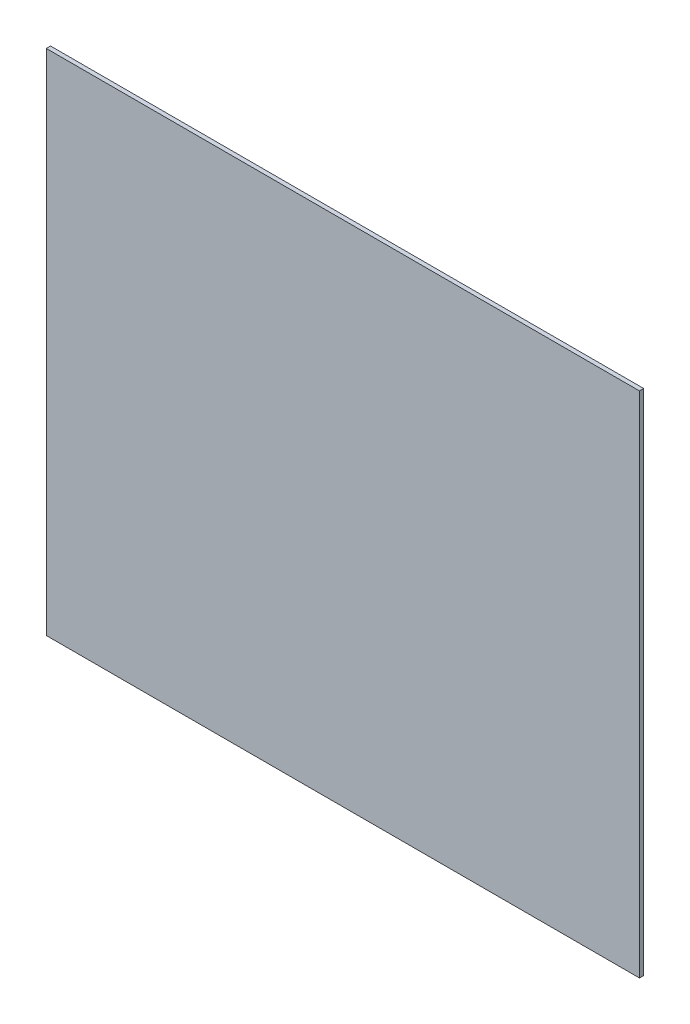
ISO-10303-21;
HEADER;
FILE_DESCRIPTION(('STEP AP214'),'2;1');
FILE_NAME('part.step','',(''),(''),'','','');
FILE_SCHEMA(('AUTOMOTIVE_DESIGN { 1 0 10303 214 1 1 1 1 }'));
ENDSEC;
DATA;
#1=APPLICATION_CONTEXT('core data for automotive mechanical design processes');
#2=APPLICATION_PROTOCOL_DEFINITION('international standard','automotive_design',2000,#1);
#3=PRODUCT_CONTEXT('',#1,'mechanical');
#4=PRODUCT('Part','Part','',(#3));
#5=PRODUCT_RELATED_PRODUCT_CATEGORY('part','',(#4));
#6=PRODUCT_DEFINITION_FORMATION('','',#4);
#7=PRODUCT_DEFINITION_CONTEXT('part definition',#1,'design');
#8=PRODUCT_DEFINITION('design','',#6,#7);
#9=PRODUCT_DEFINITION_SHAPE('','',#8);
#10=(LENGTH_UNIT() NAMED_UNIT(*) SI_UNIT(.MILLI.,.METRE.));
#11=(NAMED_UNIT(*) PLANE_ANGLE_UNIT() SI_UNIT($,.RADIAN.));
#12=(NAMED_UNIT(*) SI_UNIT($,.STERADIAN.) SOLID_ANGLE_UNIT());
#13=UNCERTAINTY_MEASURE_WITH_UNIT(LENGTH_MEASURE(1.E-05),#10,'distance_accuracy_value','');
#14=(GEOMETRIC_REPRESENTATION_CONTEXT(3) GLOBAL_UNCERTAINTY_ASSIGNED_CONTEXT((#13)) GLOBAL_UNIT_ASSIGNED_CONTEXT((#10,
#11,#12)) REPRESENTATION_CONTEXT('',''));
#15=CARTESIAN_POINT('',(0.,0.,0.));
#16=DIRECTION('',(0.,0.,1.));
#17=DIRECTION('',(1.,0.,0.));
#18=AXIS2_PLACEMENT_3D('',#15,#16,#17);
#19=CARTESIAN_POINT('',(-140.,-120.,2.));
#20=DIRECTION('',(1.,0.,0.));
#21=DIRECTION('',(0.,0.,-1.));
#22=AXIS2_PLACEMENT_3D('',#19,#20,#21);
#23=PLANE('',#22);
#24=DIRECTION('',(0.,-1.,0.));
#25=VECTOR('',#24,1.);
#26=CARTESIAN_POINT('',(-140.,-120.,0.));
#27=LINE('',#26,#25);
#28=CARTESIAN_POINT('',(-140.,120.,0.));
#29=VERTEX_POINT('',#28);
#30=CARTESIAN_POINT('',(-140.,-120.,0.));
#31=VERTEX_POINT('',#30);
#32=EDGE_CURVE('E96',#29,#31,#27,.T.);
#33=ORIENTED_EDGE('',*,*,#32,.T.);
#34=DIRECTION('',(0.,0.,-1.));
#35=VECTOR('',#34,1.);
#36=CARTESIAN_POINT('',(-140.,-120.,2.));
#37=LINE('',#36,#35);
#38=CARTESIAN_POINT('',(-140.,-120.,2.));
#39=VERTEX_POINT('',#38);
#40=EDGE_CURVE('E11',#39,#31,#37,.T.);
#41=ORIENTED_EDGE('',*,*,#40,.F.);
#42=DIRECTION('',(0.,-1.,0.));
#43=VECTOR('',#42,1.);
#44=CARTESIAN_POINT('',(-140.,-120.,2.));
#45=LINE('',#44,#43);
#46=CARTESIAN_POINT('',(-140.,120.,2.));
#47=VERTEX_POINT('',#46);
#48=EDGE_CURVE('E84',#47,#39,#45,.T.);
#49=ORIENTED_EDGE('',*,*,#48,.F.);
#50=DIRECTION('',(0.,0.,-1.));
#51=VECTOR('',#50,1.);
#52=CARTESIAN_POINT('',(-140.,120.,2.));
#53=LINE('',#52,#51);
#54=EDGE_CURVE('E92',#47,#29,#53,.T.);
#55=ORIENTED_EDGE('',*,*,#54,.T.);
#56=EDGE_LOOP('',(#33,#41,#49,#55));
#57=FACE_BOUND('',#56,.T.);
#58=ADVANCED_FACE('F33',(#57),#23,.F.);
#59=CARTESIAN_POINT('',(140.,-120.,2.));
#60=DIRECTION('',(0.,1.,0.));
#61=DIRECTION('',(-1.,0.,0.));
#62=AXIS2_PLACEMENT_3D('',#59,#60,#61);
#63=PLANE('',#62);
#64=DIRECTION('',(1.,0.,0.));
#65=VECTOR('',#64,1.);
#66=CARTESIAN_POINT('',(140.,-120.,0.));
#67=LINE('',#66,#65);
#68=CARTESIAN_POINT('',(140.,-120.,0.));
#69=VERTEX_POINT('',#68);
#70=EDGE_CURVE('E88',#31,#69,#67,.T.);
#71=ORIENTED_EDGE('',*,*,#70,.T.);
#72=DIRECTION('',(0.,0.,-1.));
#73=VECTOR('',#72,1.);
#74=CARTESIAN_POINT('',(140.,-120.,2.));
#75=LINE('',#74,#73);
#76=CARTESIAN_POINT('',(140.,-120.,2.));
#77=VERTEX_POINT('',#76);
#78=EDGE_CURVE('E41',#77,#69,#75,.T.);
#79=ORIENTED_EDGE('',*,*,#78,.F.);
#80=DIRECTION('',(1.,0.,0.));
#81=VECTOR('',#80,1.);
#82=CARTESIAN_POINT('',(140.,-120.,2.));
#83=LINE('',#82,#81);
#84=EDGE_CURVE('E79',#39,#77,#83,.T.);
#85=ORIENTED_EDGE('',*,*,#84,.F.);
#86=ORIENTED_EDGE('',*,*,#40,.T.);
#87=EDGE_LOOP('',(#71,#79,#85,#86));
#88=FACE_BOUND('',#87,.T.);
#89=ADVANCED_FACE('F87',(#88),#63,.F.);
#90=CARTESIAN_POINT('',(140.,-120.,2.));
#91=DIRECTION('',(-1.,0.,0.));
#92=DIRECTION('',(0.,0.,1.));
#93=AXIS2_PLACEMENT_3D('',#90,#91,#92);
#94=PLANE('',#93);
#95=DIRECTION('',(0.,1.,0.));
#96=VECTOR('',#95,1.);
#97=CARTESIAN_POINT('',(140.,-120.,0.));
#98=LINE('',#97,#96);
#99=CARTESIAN_POINT('',(140.,120.,0.));
#100=VERTEX_POINT('',#99);
#101=EDGE_CURVE('E66',#69,#100,#98,.T.);
#102=ORIENTED_EDGE('',*,*,#101,.T.);
#103=DIRECTION('',(0.,0.,-1.));
#104=VECTOR('',#103,1.);
#105=CARTESIAN_POINT('',(140.,120.,2.));
#106=LINE('',#105,#104);
#107=CARTESIAN_POINT('',(140.,120.,2.));
#108=VERTEX_POINT('',#107);
#109=EDGE_CURVE('E89',#108,#100,#106,.T.);
#110=ORIENTED_EDGE('',*,*,#109,.F.);
#111=DIRECTION('',(0.,1.,0.));
#112=VECTOR('',#111,1.);
#113=CARTESIAN_POINT('',(140.,-120.,2.));
#114=LINE('',#113,#112);
#115=EDGE_CURVE('E82',#77,#108,#114,.T.);
#116=ORIENTED_EDGE('',*,*,#115,.F.);
#117=ORIENTED_EDGE('',*,*,#78,.T.);
#118=EDGE_LOOP('',(#102,#110,#116,#117));
#119=FACE_BOUND('',#118,.T.);
#120=ADVANCED_FACE('F90',(#119),#94,.F.);
#121=CARTESIAN_POINT('',(140.,120.,2.));
#122=DIRECTION('',(0.,-1.,0.));
#123=DIRECTION('',(1.,0.,0.));
#124=AXIS2_PLACEMENT_3D('',#121,#122,#123);
#125=PLANE('',#124);
#126=DIRECTION('',(-1.,0.,0.));
#127=VECTOR('',#126,1.);
#128=CARTESIAN_POINT('',(140.,120.,0.));
#129=LINE('',#128,#127);
#130=EDGE_CURVE('E72',#100,#29,#129,.T.);
#131=ORIENTED_EDGE('',*,*,#130,.T.);
#132=ORIENTED_EDGE('',*,*,#54,.F.);
#133=DIRECTION('',(-1.,0.,0.));
#134=VECTOR('',#133,1.);
#135=CARTESIAN_POINT('',(140.,120.,2.));
#136=LINE('',#135,#134);
#137=EDGE_CURVE('E49',#108,#47,#136,.T.);
#138=ORIENTED_EDGE('',*,*,#137,.F.);
#139=ORIENTED_EDGE('',*,*,#109,.T.);
#140=EDGE_LOOP('',(#131,#132,#138,#139));
#141=FACE_BOUND('',#140,.T.);
#142=ADVANCED_FACE('F103',(#141),#125,.F.);
#143=CARTESIAN_POINT('',(0.,0.,2.));
#144=DIRECTION('',(0.,0.,1.));
#145=DIRECTION('',(1.,0.,0.));
#146=AXIS2_PLACEMENT_3D('',#143,#144,#145);
#147=PLANE('',#146);
#148=ORIENTED_EDGE('',*,*,#48,.T.);
#149=ORIENTED_EDGE('',*,*,#84,.T.);
#150=ORIENTED_EDGE('',*,*,#115,.T.);
#151=ORIENTED_EDGE('',*,*,#137,.T.);
#152=EDGE_LOOP('',(#148,#149,#150,#151));
#153=FACE_BOUND('',#152,.T.);
#154=ADVANCED_FACE('F80',(#153),#147,.T.);
#155=CARTESIAN_POINT('',(0.,0.,0.));
#156=DIRECTION('',(0.,0.,1.));
#157=DIRECTION('',(1.,0.,0.));
#158=AXIS2_PLACEMENT_3D('',#155,#156,#157);
#159=PLANE('',#158);
#160=ORIENTED_EDGE('',*,*,#32,.F.);
#161=ORIENTED_EDGE('',*,*,#130,.F.);
#162=ORIENTED_EDGE('',*,*,#101,.F.);
#163=ORIENTED_EDGE('',*,*,#70,.F.);
#164=EDGE_LOOP('',(#160,#161,#162,#163));
#165=FACE_BOUND('',#164,.T.);
#166=ADVANCED_FACE('F106',(#165),#159,.F.);
#167=CLOSED_SHELL('',(#58,#89,#120,#142,#154,#166));
#168=MANIFOLD_SOLID_BREP('B2',#167);
#169=ADVANCED_BREP_SHAPE_REPRESENTATION('',(#18,#168),#14);
#170=SHAPE_DEFINITION_REPRESENTATION(#9,#169);
ENDSEC;
END-ISO-10303-21;
